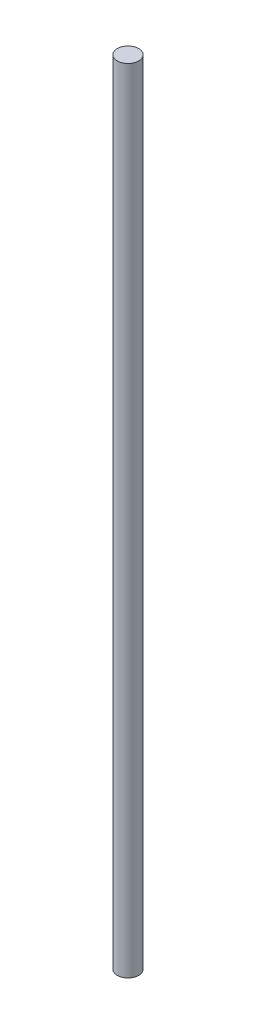
ISO-10303-21;
HEADER;
FILE_DESCRIPTION(('STEP AP214'),'2;1');
FILE_NAME('part.step','',(''),(''),'','','');
FILE_SCHEMA(('AUTOMOTIVE_DESIGN { 1 0 10303 214 1 1 1 1 }'));
ENDSEC;
DATA;
#1=APPLICATION_CONTEXT('core data for automotive mechanical design processes');
#2=APPLICATION_PROTOCOL_DEFINITION('international standard','automotive_design',2000,#1);
#3=PRODUCT_CONTEXT('',#1,'mechanical');
#4=PRODUCT('Part','Part','',(#3));
#5=PRODUCT_RELATED_PRODUCT_CATEGORY('part','',(#4));
#6=PRODUCT_DEFINITION_FORMATION('','',#4);
#7=PRODUCT_DEFINITION_CONTEXT('part definition',#1,'design');
#8=PRODUCT_DEFINITION('design','',#6,#7);
#9=PRODUCT_DEFINITION_SHAPE('','',#8);
#10=(LENGTH_UNIT() NAMED_UNIT(*) SI_UNIT(.MILLI.,.METRE.));
#11=(NAMED_UNIT(*) PLANE_ANGLE_UNIT() SI_UNIT($,.RADIAN.));
#12=(NAMED_UNIT(*) SI_UNIT($,.STERADIAN.) SOLID_ANGLE_UNIT());
#13=UNCERTAINTY_MEASURE_WITH_UNIT(LENGTH_MEASURE(1.E-05),#10,'distance_accuracy_value','');
#14=(GEOMETRIC_REPRESENTATION_CONTEXT(3) GLOBAL_UNCERTAINTY_ASSIGNED_CONTEXT((#13)) GLOBAL_UNIT_ASSIGNED_CONTEXT((#10,
#11,#12)) REPRESENTATION_CONTEXT('',''));
#15=CARTESIAN_POINT('',(0.,0.,0.));
#16=DIRECTION('',(0.,0.,1.));
#17=DIRECTION('',(1.,0.,0.));
#18=AXIS2_PLACEMENT_3D('',#15,#16,#17);
#19=CARTESIAN_POINT('',(0.,-92.25,0.));
#20=DIRECTION('',(0.,1.,0.));
#21=DIRECTION('',(0.,0.,1.));
#22=AXIS2_PLACEMENT_3D('',#19,#20,#21);
#23=PLANE('',#22);
#24=CARTESIAN_POINT('',(0.,-92.25,0.));
#25=DIRECTION('',(0.,1.,0.));
#26=DIRECTION('',(0.,0.,1.));
#27=AXIS2_PLACEMENT_3D('',#24,#25,#26);
#28=CIRCLE('',#27,2.5);
#29=CARTESIAN_POINT('',(0.,-92.25,2.5));
#30=VERTEX_POINT('',#29);
#31=EDGE_CURVE('E42',#30,#30,#28,.T.);
#32=ORIENTED_EDGE('',*,*,#31,.F.);
#33=EDGE_LOOP('',(#32));
#34=FACE_BOUND('',#33,.T.);
#35=ADVANCED_FACE('F34',(#34),#23,.F.);
#36=CARTESIAN_POINT('',(0.,92.25,0.));
#37=DIRECTION('',(0.,1.,0.));
#38=DIRECTION('',(0.,0.,1.));
#39=AXIS2_PLACEMENT_3D('',#36,#37,#38);
#40=CYLINDRICAL_SURFACE('',#39,2.5);
#41=CARTESIAN_POINT('',(0.,92.25,0.));
#42=DIRECTION('',(0.,1.,0.));
#43=DIRECTION('',(0.,0.,1.));
#44=AXIS2_PLACEMENT_3D('',#41,#42,#43);
#45=CIRCLE('',#44,2.5);
#46=CARTESIAN_POINT('',(0.,92.25,2.5));
#47=VERTEX_POINT('',#46);
#48=EDGE_CURVE('E46',#47,#47,#45,.T.);
#49=ORIENTED_EDGE('',*,*,#48,.F.);
#50=EDGE_LOOP('',(#49));
#51=FACE_BOUND('',#50,.T.);
#52=ORIENTED_EDGE('',*,*,#31,.T.);
#53=EDGE_LOOP('',(#52));
#54=FACE_BOUND('',#53,.T.);
#55=ADVANCED_FACE('F93',(#51,#54),#40,.T.);
#56=CARTESIAN_POINT('',(0.,92.25,0.));
#57=DIRECTION('',(0.,1.,0.));
#58=DIRECTION('',(0.,0.,1.));
#59=AXIS2_PLACEMENT_3D('',#56,#57,#58);
#60=PLANE('',#59);
#61=ORIENTED_EDGE('',*,*,#48,.T.);
#62=EDGE_LOOP('',(#61));
#63=FACE_BOUND('',#62,.T.);
#64=ADVANCED_FACE('F75',(#63),#60,.T.);
#65=CLOSED_SHELL('',(#35,#55,#64));
#66=CARTESIAN_POINT('',(0.,92.25,0.));
#67=DIRECTION('',(0.,1.,0.));
#68=DIRECTION('',(0.,0.,1.));
#69=AXIS2_PLACEMENT_3D('',#66,#67,#68);
#70=CYLINDRICAL_SURFACE('',#69,1.00000000000006);
#71=CARTESIAN_POINT('',(0.,-90.75,0.));
#72=DIRECTION('',(0.,1.,0.));
#73=DIRECTION('',(0.,0.,1.));
#74=AXIS2_PLACEMENT_3D('',#71,#72,#73);
#75=CIRCLE('',#74,1.00000000000007);
#76=CARTESIAN_POINT('',(0.,-90.75,1.00000000000007));
#77=VERTEX_POINT('',#76);
#78=EDGE_CURVE('E10',#77,#77,#75,.T.);
#79=ORIENTED_EDGE('',*,*,#78,.F.);
#80=EDGE_LOOP('',(#79));
#81=FACE_BOUND('',#80,.T.);
#82=CARTESIAN_POINT('',(0.,90.75,0.));
#83=DIRECTION('',(0.,1.,0.));
#84=DIRECTION('',(0.,0.,1.));
#85=AXIS2_PLACEMENT_3D('',#82,#83,#84);
#86=CIRCLE('',#85,1.00000000000005);
#87=CARTESIAN_POINT('',(0.,90.75,1.00000000000005));
#88=VERTEX_POINT('',#87);
#89=EDGE_CURVE('E50',#88,#88,#86,.T.);
#90=ORIENTED_EDGE('',*,*,#89,.T.);
#91=EDGE_LOOP('',(#90));
#92=FACE_BOUND('',#91,.T.);
#93=ADVANCED_FACE('F36',(#81,#92),#70,.F.);
#94=CARTESIAN_POINT('',(0.,-90.75,0.));
#95=DIRECTION('',(0.,-1.,0.));
#96=DIRECTION('',(0.,0.,-1.));
#97=AXIS2_PLACEMENT_3D('',#94,#95,#96);
#98=PLANE('',#97);
#99=ORIENTED_EDGE('',*,*,#78,.T.);
#100=EDGE_LOOP('',(#99));
#101=FACE_BOUND('',#100,.T.);
#102=ADVANCED_FACE('F59',(#101),#98,.F.);
#103=CARTESIAN_POINT('',(0.,90.75,0.));
#104=DIRECTION('',(0.,1.,0.));
#105=DIRECTION('',(0.,0.,1.));
#106=AXIS2_PLACEMENT_3D('',#103,#104,#105);
#107=PLANE('',#106);
#108=ORIENTED_EDGE('',*,*,#89,.F.);
#109=EDGE_LOOP('',(#108));
#110=FACE_BOUND('',#109,.T.);
#111=ADVANCED_FACE('F57',(#110),#107,.F.);
#112=CLOSED_SHELL('',(#93,#102,#111));
#113=ORIENTED_CLOSED_SHELL('',*,#112,.T.);
#114=BREP_WITH_VOIDS('B2',#65,(#113));
#115=ADVANCED_BREP_SHAPE_REPRESENTATION('',(#18,#114),#14);
#116=SHAPE_DEFINITION_REPRESENTATION(#9,#115);
ENDSEC;
END-ISO-10303-21;
